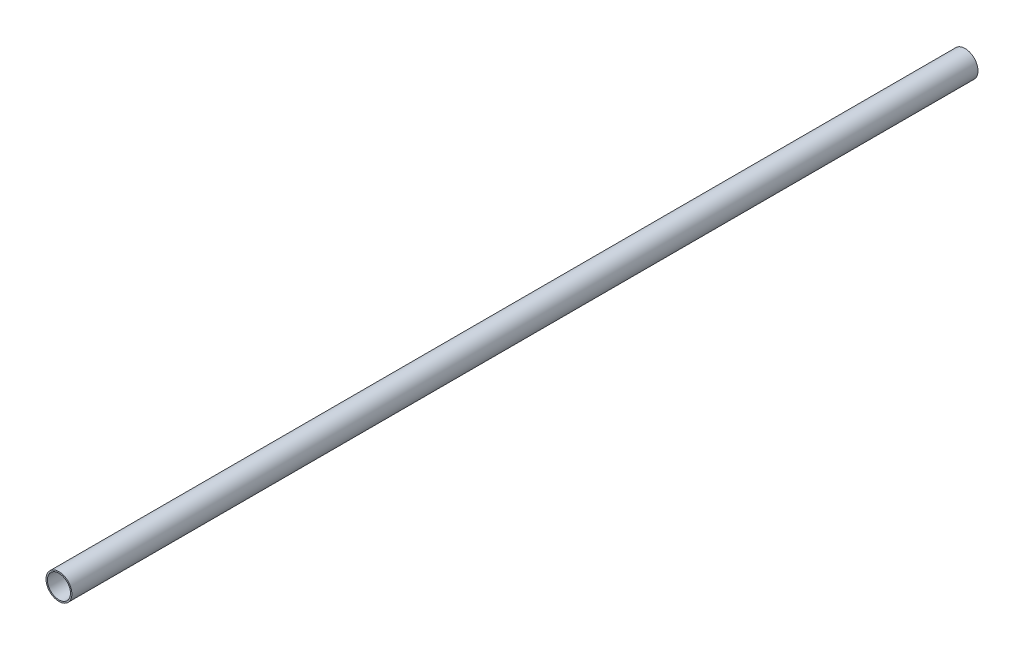
ISO-10303-21;
HEADER;
FILE_DESCRIPTION(('STEP AP214'),'2;1');
FILE_NAME('part.step','',(''),(''),'','','');
FILE_SCHEMA(('AUTOMOTIVE_DESIGN { 1 0 10303 214 1 1 1 1 }'));
ENDSEC;
DATA;
#1=APPLICATION_CONTEXT('core data for automotive mechanical design processes');
#2=APPLICATION_PROTOCOL_DEFINITION('international standard','automotive_design',2000,#1);
#3=PRODUCT_CONTEXT('',#1,'mechanical');
#4=PRODUCT('Part','Part','',(#3));
#5=PRODUCT_RELATED_PRODUCT_CATEGORY('part','',(#4));
#6=PRODUCT_DEFINITION_FORMATION('','',#4);
#7=PRODUCT_DEFINITION_CONTEXT('part definition',#1,'design');
#8=PRODUCT_DEFINITION('design','',#6,#7);
#9=PRODUCT_DEFINITION_SHAPE('','',#8);
#10=(LENGTH_UNIT() NAMED_UNIT(*) SI_UNIT(.MILLI.,.METRE.));
#11=(NAMED_UNIT(*) PLANE_ANGLE_UNIT() SI_UNIT($,.RADIAN.));
#12=(NAMED_UNIT(*) SI_UNIT($,.STERADIAN.) SOLID_ANGLE_UNIT());
#13=UNCERTAINTY_MEASURE_WITH_UNIT(LENGTH_MEASURE(1.E-05),#10,'distance_accuracy_value','');
#14=(GEOMETRIC_REPRESENTATION_CONTEXT(3) GLOBAL_UNCERTAINTY_ASSIGNED_CONTEXT((#13)) GLOBAL_UNIT_ASSIGNED_CONTEXT((#10,
#11,#12)) REPRESENTATION_CONTEXT('',''));
#15=CARTESIAN_POINT('',(0.,0.,0.));
#16=DIRECTION('',(0.,0.,1.));
#17=DIRECTION('',(1.,0.,0.));
#18=AXIS2_PLACEMENT_3D('',#15,#16,#17);
#19=CARTESIAN_POINT('',(0.,0.,280.));
#20=DIRECTION('',(0.,0.,1.));
#21=DIRECTION('',(1.,0.,0.));
#22=AXIS2_PLACEMENT_3D('',#19,#20,#21);
#23=PLANE('',#22);
#24=CARTESIAN_POINT('',(0.,0.,280.));
#25=DIRECTION('',(0.,0.,-1.));
#26=DIRECTION('',(1.,0.,0.));
#27=AXIS2_PLACEMENT_3D('',#24,#25,#26);
#28=CIRCLE('',#27,4.455);
#29=CARTESIAN_POINT('',(-4.455,0.,280.));
#30=VERTEX_POINT('',#29);
#31=EDGE_CURVE('E60',#30,#30,#28,.T.);
#32=ORIENTED_EDGE('',*,*,#31,.T.);
#33=EDGE_LOOP('',(#32));
#34=FACE_BOUND('',#33,.T.);
#35=CARTESIAN_POINT('',(0.,0.,280.));
#36=DIRECTION('',(0.,0.,1.));
#37=DIRECTION('',(1.,0.,0.));
#38=AXIS2_PLACEMENT_3D('',#35,#36,#37);
#39=CIRCLE('',#38,5.);
#40=CARTESIAN_POINT('',(-5.,0.,280.));
#41=VERTEX_POINT('',#40);
#42=EDGE_CURVE('E43',#41,#41,#39,.T.);
#43=ORIENTED_EDGE('',*,*,#42,.T.);
#44=EDGE_LOOP('',(#43));
#45=FACE_BOUND('',#44,.T.);
#46=ADVANCED_FACE('F34',(#34,#45),#23,.T.);
#47=CARTESIAN_POINT('',(0.,0.,0.));
#48=DIRECTION('',(0.,0.,1.));
#49=DIRECTION('',(1.,0.,0.));
#50=AXIS2_PLACEMENT_3D('',#47,#48,#49);
#51=CYLINDRICAL_SURFACE('',#50,5.);
#52=ORIENTED_EDGE('',*,*,#42,.F.);
#53=DIRECTION('',(0.,0.,-1.));
#54=VECTOR('',#53,1.);
#55=CARTESIAN_POINT('',(-5.,0.,0.));
#56=LINE('',#55,#54);
#57=CARTESIAN_POINT('',(-5.,0.,0.));
#58=VERTEX_POINT('',#57);
#59=EDGE_CURVE('E11',#41,#58,#56,.T.);
#60=ORIENTED_EDGE('',*,*,#59,.T.);
#61=ORIENTED_EDGE('',*,*,#59,.F.);
#62=EDGE_LOOP('',(#52,#60,#61));
#63=FACE_BOUND('',#62,.T.);
#64=CARTESIAN_POINT('',(0.,0.,-70.));
#65=DIRECTION('',(0.,0.,1.));
#66=DIRECTION('',(1.,0.,0.));
#67=AXIS2_PLACEMENT_3D('',#64,#65,#66);
#68=CIRCLE('',#67,5.);
#69=CARTESIAN_POINT('',(5.,0.,-70.));
#70=VERTEX_POINT('',#69);
#71=EDGE_CURVE('E63',#70,#70,#68,.T.);
#72=ORIENTED_EDGE('',*,*,#71,.T.);
#73=EDGE_LOOP('',(#72));
#74=FACE_BOUND('',#73,.T.);
#75=ADVANCED_FACE('F77',(#63,#74),#51,.T.);
#76=CARTESIAN_POINT('',(0.,0.,0.));
#77=DIRECTION('',(0.,0.,1.));
#78=DIRECTION('',(1.,0.,0.));
#79=AXIS2_PLACEMENT_3D('',#76,#77,#78);
#80=CYLINDRICAL_SURFACE('',#79,4.455);
#81=ORIENTED_EDGE('',*,*,#31,.F.);
#82=DIRECTION('',(0.,0.,-1.));
#83=VECTOR('',#82,1.);
#84=CARTESIAN_POINT('',(-4.455,0.,0.));
#85=LINE('',#84,#83);
#86=CARTESIAN_POINT('',(-4.455,0.,0.));
#87=VERTEX_POINT('',#86);
#88=EDGE_CURVE('E56',#30,#87,#85,.T.);
#89=ORIENTED_EDGE('',*,*,#88,.T.);
#90=ORIENTED_EDGE('',*,*,#88,.F.);
#91=EDGE_LOOP('',(#81,#89,#90));
#92=FACE_BOUND('',#91,.T.);
#93=CARTESIAN_POINT('',(0.,0.,-70.));
#94=DIRECTION('',(0.,0.,1.));
#95=DIRECTION('',(1.,0.,0.));
#96=AXIS2_PLACEMENT_3D('',#93,#94,#95);
#97=CIRCLE('',#96,4.455);
#98=CARTESIAN_POINT('',(4.455,0.,-70.));
#99=VERTEX_POINT('',#98);
#100=EDGE_CURVE('E70',#99,#99,#97,.T.);
#101=ORIENTED_EDGE('',*,*,#100,.F.);
#102=EDGE_LOOP('',(#101));
#103=FACE_BOUND('',#102,.T.);
#104=ADVANCED_FACE('F58',(#92,#103),#80,.F.);
#105=CARTESIAN_POINT('',(0.,0.,-70.));
#106=DIRECTION('',(0.,0.,1.));
#107=DIRECTION('',(1.,0.,0.));
#108=AXIS2_PLACEMENT_3D('',#105,#106,#107);
#109=PLANE('',#108);
#110=ORIENTED_EDGE('',*,*,#100,.T.);
#111=EDGE_LOOP('',(#110));
#112=FACE_BOUND('',#111,.T.);
#113=ORIENTED_EDGE('',*,*,#71,.F.);
#114=EDGE_LOOP('',(#113));
#115=FACE_BOUND('',#114,.T.);
#116=ADVANCED_FACE('F74',(#112,#115),#109,.F.);
#117=CLOSED_SHELL('',(#46,#75,#104,#116));
#118=MANIFOLD_SOLID_BREP('B2',#117);
#119=ADVANCED_BREP_SHAPE_REPRESENTATION('',(#18,#118),#14);
#120=SHAPE_DEFINITION_REPRESENTATION(#9,#119);
ENDSEC;
END-ISO-10303-21;
